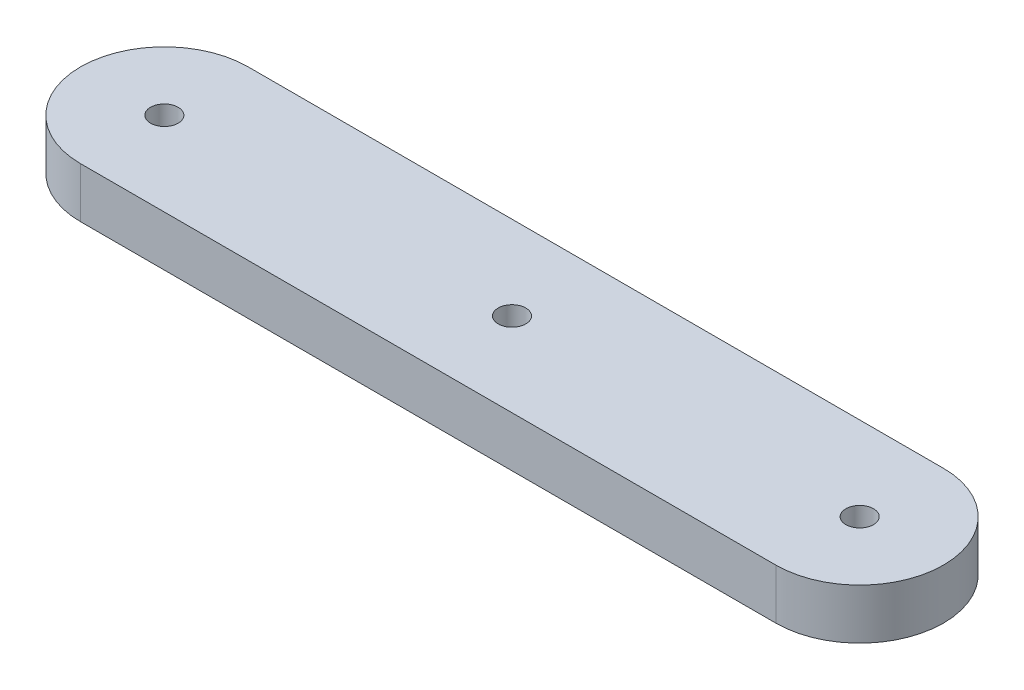
ISO-10303-21;
HEADER;
FILE_DESCRIPTION(('STEP AP214'),'2;1');
FILE_NAME('part.step','',(''),(''),'','','');
FILE_SCHEMA(('AUTOMOTIVE_DESIGN { 1 0 10303 214 1 1 1 1 }'));
ENDSEC;
DATA;
#1=APPLICATION_CONTEXT('core data for automotive mechanical design processes');
#2=APPLICATION_PROTOCOL_DEFINITION('international standard','automotive_design',2000,#1);
#3=PRODUCT_CONTEXT('',#1,'mechanical');
#4=PRODUCT('Part','Part','',(#3));
#5=PRODUCT_RELATED_PRODUCT_CATEGORY('part','',(#4));
#6=PRODUCT_DEFINITION_FORMATION('','',#4);
#7=PRODUCT_DEFINITION_CONTEXT('part definition',#1,'design');
#8=PRODUCT_DEFINITION('design','',#6,#7);
#9=PRODUCT_DEFINITION_SHAPE('','',#8);
#10=(LENGTH_UNIT() NAMED_UNIT(*) SI_UNIT(.MILLI.,.METRE.));
#11=(NAMED_UNIT(*) PLANE_ANGLE_UNIT() SI_UNIT($,.RADIAN.));
#12=(NAMED_UNIT(*) SI_UNIT($,.STERADIAN.) SOLID_ANGLE_UNIT());
#13=UNCERTAINTY_MEASURE_WITH_UNIT(LENGTH_MEASURE(1.E-05),#10,'distance_accuracy_value','');
#14=(GEOMETRIC_REPRESENTATION_CONTEXT(3) GLOBAL_UNCERTAINTY_ASSIGNED_CONTEXT((#13)) GLOBAL_UNIT_ASSIGNED_CONTEXT((#10,
#11,#12)) REPRESENTATION_CONTEXT('',''));
#15=CARTESIAN_POINT('',(0.,0.,0.));
#16=DIRECTION('',(0.,0.,1.));
#17=DIRECTION('',(1.,0.,0.));
#18=AXIS2_PLACEMENT_3D('',#15,#16,#17);
#19=CARTESIAN_POINT('',(-41.48,6.,0.));
#20=DIRECTION('',(0.,1.,0.));
#21=DIRECTION('',(0.,0.,1.));
#22=AXIS2_PLACEMENT_3D('',#19,#20,#21);
#23=PLANE('',#22);
#24=CARTESIAN_POINT('',(41.48,6.,0.));
#25=DIRECTION('',(0.,1.,0.));
#26=DIRECTION('',(0.,0.,1.));
#27=AXIS2_PLACEMENT_3D('',#24,#25,#26);
#28=CIRCLE('',#27,1.65);
#29=CARTESIAN_POINT('',(41.48,6.,1.64999999999999));
#30=VERTEX_POINT('',#29);
#31=EDGE_CURVE('E115',#30,#30,#28,.T.);
#32=ORIENTED_EDGE('',*,*,#31,.F.);
#33=EDGE_LOOP('',(#32));
#34=FACE_BOUND('',#33,.T.);
#35=CARTESIAN_POINT('',(-41.48,6.,0.));
#36=DIRECTION('',(0.,1.,0.));
#37=DIRECTION('',(0.,0.,1.));
#38=AXIS2_PLACEMENT_3D('',#35,#36,#37);
#39=CIRCLE('',#38,10.);
#40=CARTESIAN_POINT('',(-41.48,6.,-10.));
#41=VERTEX_POINT('',#40);
#42=CARTESIAN_POINT('',(-41.48,6.,10.));
#43=VERTEX_POINT('',#42);
#44=EDGE_CURVE('E85',#41,#43,#39,.T.);
#45=ORIENTED_EDGE('',*,*,#44,.T.);
#46=DIRECTION('',(1.,0.,0.));
#47=VECTOR('',#46,1.);
#48=CARTESIAN_POINT('',(-41.48,6.,10.));
#49=LINE('',#48,#47);
#50=CARTESIAN_POINT('',(41.48,6.,9.99999999999999));
#51=VERTEX_POINT('',#50);
#52=EDGE_CURVE('E80',#43,#51,#49,.T.);
#53=ORIENTED_EDGE('',*,*,#52,.T.);
#54=CARTESIAN_POINT('',(41.48,6.,0.));
#55=DIRECTION('',(0.,1.,0.));
#56=DIRECTION('',(0.,0.,1.));
#57=AXIS2_PLACEMENT_3D('',#54,#55,#56);
#58=CIRCLE('',#57,10.);
#59=CARTESIAN_POINT('',(41.48,6.,-10.));
#60=VERTEX_POINT('',#59);
#61=EDGE_CURVE('E83',#51,#60,#58,.T.);
#62=ORIENTED_EDGE('',*,*,#61,.T.);
#63=DIRECTION('',(-1.,0.,0.));
#64=VECTOR('',#63,1.);
#65=CARTESIAN_POINT('',(-41.48,6.,-10.));
#66=LINE('',#65,#64);
#67=EDGE_CURVE('E50',#60,#41,#66,.T.);
#68=ORIENTED_EDGE('',*,*,#67,.T.);
#69=EDGE_LOOP('',(#45,#53,#62,#68));
#70=FACE_BOUND('',#69,.T.);
#71=CARTESIAN_POINT('',(-41.48,6.,0.));
#72=DIRECTION('',(0.,1.,0.));
#73=DIRECTION('',(0.,0.,1.));
#74=AXIS2_PLACEMENT_3D('',#71,#72,#73);
#75=CIRCLE('',#74,1.65);
#76=CARTESIAN_POINT('',(-41.48,6.,1.65));
#77=VERTEX_POINT('',#76);
#78=EDGE_CURVE('E100',#77,#77,#75,.T.);
#79=ORIENTED_EDGE('',*,*,#78,.F.);
#80=EDGE_LOOP('',(#79));
#81=FACE_BOUND('',#80,.T.);
#82=CARTESIAN_POINT('',(0.,6.,0.));
#83=DIRECTION('',(0.,1.,0.));
#84=DIRECTION('',(0.,0.,1.));
#85=AXIS2_PLACEMENT_3D('',#82,#83,#84);
#86=CIRCLE('',#85,1.65);
#87=CARTESIAN_POINT('',(0.,6.,1.65));
#88=VERTEX_POINT('',#87);
#89=EDGE_CURVE('E121',#88,#88,#86,.T.);
#90=ORIENTED_EDGE('',*,*,#89,.F.);
#91=EDGE_LOOP('',(#90));
#92=FACE_BOUND('',#91,.T.);
#93=ADVANCED_FACE('F33',(#34,#70,#81,#92),#23,.T.);
#94=CARTESIAN_POINT('',(-41.48,0.,0.));
#95=DIRECTION('',(0.,1.,0.));
#96=DIRECTION('',(0.,0.,1.));
#97=AXIS2_PLACEMENT_3D('',#94,#95,#96);
#98=PLANE('',#97);
#99=CARTESIAN_POINT('',(41.48,0.,0.));
#100=DIRECTION('',(0.,1.,0.));
#101=DIRECTION('',(0.,0.,1.));
#102=AXIS2_PLACEMENT_3D('',#99,#100,#101);
#103=CIRCLE('',#102,1.65);
#104=CARTESIAN_POINT('',(41.48,0.,1.64999999999999));
#105=VERTEX_POINT('',#104);
#106=EDGE_CURVE('E118',#105,#105,#103,.T.);
#107=ORIENTED_EDGE('',*,*,#106,.T.);
#108=EDGE_LOOP('',(#107));
#109=FACE_BOUND('',#108,.T.);
#110=CARTESIAN_POINT('',(-41.48,0.,0.));
#111=DIRECTION('',(0.,1.,0.));
#112=DIRECTION('',(0.,0.,1.));
#113=AXIS2_PLACEMENT_3D('',#110,#111,#112);
#114=CIRCLE('',#113,10.);
#115=CARTESIAN_POINT('',(-41.48,0.,-10.));
#116=VERTEX_POINT('',#115);
#117=CARTESIAN_POINT('',(-41.48,0.,10.));
#118=VERTEX_POINT('',#117);
#119=EDGE_CURVE('E97',#116,#118,#114,.T.);
#120=ORIENTED_EDGE('',*,*,#119,.F.);
#121=DIRECTION('',(-1.,0.,0.));
#122=VECTOR('',#121,1.);
#123=CARTESIAN_POINT('',(-41.48,0.,-10.));
#124=LINE('',#123,#122);
#125=CARTESIAN_POINT('',(41.48,0.,-10.));
#126=VERTEX_POINT('',#125);
#127=EDGE_CURVE('E73',#126,#116,#124,.T.);
#128=ORIENTED_EDGE('',*,*,#127,.F.);
#129=CARTESIAN_POINT('',(41.48,0.,0.));
#130=DIRECTION('',(0.,1.,0.));
#131=DIRECTION('',(0.,0.,1.));
#132=AXIS2_PLACEMENT_3D('',#129,#130,#131);
#133=CIRCLE('',#132,10.);
#134=CARTESIAN_POINT('',(41.48,0.,9.99999999999999));
#135=VERTEX_POINT('',#134);
#136=EDGE_CURVE('E67',#135,#126,#133,.T.);
#137=ORIENTED_EDGE('',*,*,#136,.F.);
#138=DIRECTION('',(1.,0.,0.));
#139=VECTOR('',#138,1.);
#140=CARTESIAN_POINT('',(-41.48,0.,10.));
#141=LINE('',#140,#139);
#142=EDGE_CURVE('E89',#118,#135,#141,.T.);
#143=ORIENTED_EDGE('',*,*,#142,.F.);
#144=EDGE_LOOP('',(#120,#128,#137,#143));
#145=FACE_BOUND('',#144,.T.);
#146=CARTESIAN_POINT('',(-41.48,0.,0.));
#147=DIRECTION('',(0.,1.,0.));
#148=DIRECTION('',(0.,0.,1.));
#149=AXIS2_PLACEMENT_3D('',#146,#147,#148);
#150=CIRCLE('',#149,1.65);
#151=CARTESIAN_POINT('',(-41.48,0.,1.65));
#152=VERTEX_POINT('',#151);
#153=EDGE_CURVE('E112',#152,#152,#150,.T.);
#154=ORIENTED_EDGE('',*,*,#153,.T.);
#155=EDGE_LOOP('',(#154));
#156=FACE_BOUND('',#155,.T.);
#157=CARTESIAN_POINT('',(0.,0.,0.));
#158=DIRECTION('',(0.,1.,0.));
#159=DIRECTION('',(0.,0.,1.));
#160=AXIS2_PLACEMENT_3D('',#157,#158,#159);
#161=CIRCLE('',#160,1.65);
#162=CARTESIAN_POINT('',(0.,0.,1.65));
#163=VERTEX_POINT('',#162);
#164=EDGE_CURVE('E124',#163,#163,#161,.T.);
#165=ORIENTED_EDGE('',*,*,#164,.T.);
#166=EDGE_LOOP('',(#165));
#167=FACE_BOUND('',#166,.T.);
#168=ADVANCED_FACE('F108',(#109,#145,#156,#167),#98,.F.);
#169=CARTESIAN_POINT('',(-41.48,6.,0.));
#170=DIRECTION('',(0.,-1.,0.));
#171=DIRECTION('',(0.,0.,-1.));
#172=AXIS2_PLACEMENT_3D('',#169,#170,#171);
#173=CYLINDRICAL_SURFACE('',#172,10.);
#174=ORIENTED_EDGE('',*,*,#119,.T.);
#175=DIRECTION('',(0.,-1.,0.));
#176=VECTOR('',#175,1.);
#177=CARTESIAN_POINT('',(-41.48,6.,10.));
#178=LINE('',#177,#176);
#179=EDGE_CURVE('E11',#43,#118,#178,.T.);
#180=ORIENTED_EDGE('',*,*,#179,.F.);
#181=ORIENTED_EDGE('',*,*,#44,.F.);
#182=DIRECTION('',(0.,-1.,0.));
#183=VECTOR('',#182,1.);
#184=CARTESIAN_POINT('',(-41.48,6.,-10.));
#185=LINE('',#184,#183);
#186=EDGE_CURVE('E93',#41,#116,#185,.T.);
#187=ORIENTED_EDGE('',*,*,#186,.T.);
#188=EDGE_LOOP('',(#174,#180,#181,#187));
#189=FACE_BOUND('',#188,.T.);
#190=ADVANCED_FACE('F35',(#189),#173,.T.);
#191=CARTESIAN_POINT('',(-41.48,6.,10.));
#192=DIRECTION('',(0.,0.,-1.));
#193=DIRECTION('',(-1.,0.,0.));
#194=AXIS2_PLACEMENT_3D('',#191,#192,#193);
#195=PLANE('',#194);
#196=ORIENTED_EDGE('',*,*,#142,.T.);
#197=DIRECTION('',(0.,-1.,0.));
#198=VECTOR('',#197,1.);
#199=CARTESIAN_POINT('',(41.48,6.,9.99999999999999));
#200=LINE('',#199,#198);
#201=EDGE_CURVE('E42',#51,#135,#200,.T.);
#202=ORIENTED_EDGE('',*,*,#201,.F.);
#203=ORIENTED_EDGE('',*,*,#52,.F.);
#204=ORIENTED_EDGE('',*,*,#179,.T.);
#205=EDGE_LOOP('',(#196,#202,#203,#204));
#206=FACE_BOUND('',#205,.T.);
#207=ADVANCED_FACE('F88',(#206),#195,.F.);
#208=CARTESIAN_POINT('',(41.48,6.,0.));
#209=DIRECTION('',(0.,-1.,0.));
#210=DIRECTION('',(0.,0.,-1.));
#211=AXIS2_PLACEMENT_3D('',#208,#209,#210);
#212=CYLINDRICAL_SURFACE('',#211,10.);
#213=ORIENTED_EDGE('',*,*,#136,.T.);
#214=DIRECTION('',(0.,-1.,0.));
#215=VECTOR('',#214,1.);
#216=CARTESIAN_POINT('',(41.48,6.,-10.));
#217=LINE('',#216,#215);
#218=EDGE_CURVE('E90',#60,#126,#217,.T.);
#219=ORIENTED_EDGE('',*,*,#218,.F.);
#220=ORIENTED_EDGE('',*,*,#61,.F.);
#221=ORIENTED_EDGE('',*,*,#201,.T.);
#222=EDGE_LOOP('',(#213,#219,#220,#221));
#223=FACE_BOUND('',#222,.T.);
#224=ADVANCED_FACE('F91',(#223),#212,.T.);
#225=CARTESIAN_POINT('',(-41.48,6.,-10.));
#226=DIRECTION('',(0.,0.,1.));
#227=DIRECTION('',(1.,0.,0.));
#228=AXIS2_PLACEMENT_3D('',#225,#226,#227);
#229=PLANE('',#228);
#230=ORIENTED_EDGE('',*,*,#127,.T.);
#231=ORIENTED_EDGE('',*,*,#186,.F.);
#232=ORIENTED_EDGE('',*,*,#67,.F.);
#233=ORIENTED_EDGE('',*,*,#218,.T.);
#234=EDGE_LOOP('',(#230,#231,#232,#233));
#235=FACE_BOUND('',#234,.T.);
#236=ADVANCED_FACE('F105',(#235),#229,.F.);
#237=CARTESIAN_POINT('',(-41.48,6.,0.));
#238=DIRECTION('',(0.,-1.,0.));
#239=DIRECTION('',(0.,0.,-1.));
#240=AXIS2_PLACEMENT_3D('',#237,#238,#239);
#241=CYLINDRICAL_SURFACE('',#240,1.65);
#242=ORIENTED_EDGE('',*,*,#78,.T.);
#243=EDGE_LOOP('',(#242));
#244=FACE_BOUND('',#243,.T.);
#245=ORIENTED_EDGE('',*,*,#153,.F.);
#246=EDGE_LOOP('',(#245));
#247=FACE_BOUND('',#246,.T.);
#248=ADVANCED_FACE('F143',(#244,#247),#241,.F.);
#249=CARTESIAN_POINT('',(41.48,6.,0.));
#250=DIRECTION('',(0.,-1.,0.));
#251=DIRECTION('',(0.,0.,-1.));
#252=AXIS2_PLACEMENT_3D('',#249,#250,#251);
#253=CYLINDRICAL_SURFACE('',#252,1.65);
#254=ORIENTED_EDGE('',*,*,#31,.T.);
#255=EDGE_LOOP('',(#254));
#256=FACE_BOUND('',#255,.T.);
#257=ORIENTED_EDGE('',*,*,#106,.F.);
#258=EDGE_LOOP('',(#257));
#259=FACE_BOUND('',#258,.T.);
#260=ADVANCED_FACE('F189',(#256,#259),#253,.F.);
#261=CARTESIAN_POINT('',(0.,6.,0.));
#262=DIRECTION('',(0.,-1.,0.));
#263=DIRECTION('',(0.,0.,-1.));
#264=AXIS2_PLACEMENT_3D('',#261,#262,#263);
#265=CYLINDRICAL_SURFACE('',#264,1.65);
#266=ORIENTED_EDGE('',*,*,#89,.T.);
#267=EDGE_LOOP('',(#266));
#268=FACE_BOUND('',#267,.T.);
#269=ORIENTED_EDGE('',*,*,#164,.F.);
#270=EDGE_LOOP('',(#269));
#271=FACE_BOUND('',#270,.T.);
#272=ADVANCED_FACE('F130',(#268,#271),#265,.F.);
#273=CLOSED_SHELL('',(#93,#168,#190,#207,#224,#236,#248,#260,#272));
#274=MANIFOLD_SOLID_BREP('B2',#273);
#275=ADVANCED_BREP_SHAPE_REPRESENTATION('',(#18,#274),#14);
#276=SHAPE_DEFINITION_REPRESENTATION(#9,#275);
ENDSEC;
END-ISO-10303-21;
